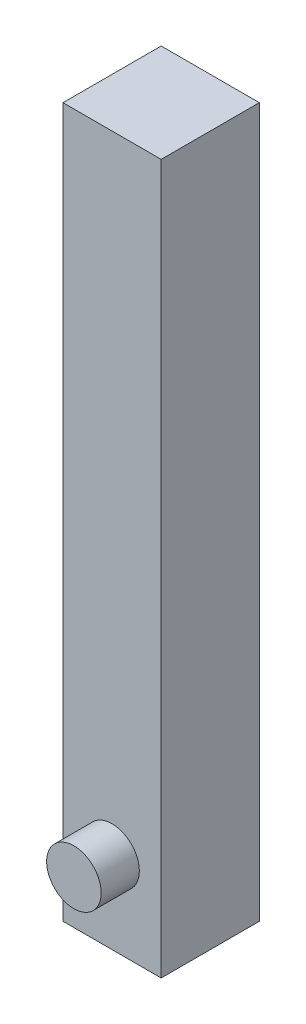
ISO-10303-21;
HEADER;
FILE_DESCRIPTION(('STEP AP214'),'2;1');
FILE_NAME('part.step','',(''),(''),'','','');
FILE_SCHEMA(('AUTOMOTIVE_DESIGN { 1 0 10303 214 1 1 1 1 }'));
ENDSEC;
DATA;
#1=APPLICATION_CONTEXT('core data for automotive mechanical design processes');
#2=APPLICATION_PROTOCOL_DEFINITION('international standard','automotive_design',2000,#1);
#3=PRODUCT_CONTEXT('',#1,'mechanical');
#4=PRODUCT('Part','Part','',(#3));
#5=PRODUCT_RELATED_PRODUCT_CATEGORY('part','',(#4));
#6=PRODUCT_DEFINITION_FORMATION('','',#4);
#7=PRODUCT_DEFINITION_CONTEXT('part definition',#1,'design');
#8=PRODUCT_DEFINITION('design','',#6,#7);
#9=PRODUCT_DEFINITION_SHAPE('','',#8);
#10=(LENGTH_UNIT() NAMED_UNIT(*) SI_UNIT(.MILLI.,.METRE.));
#11=(NAMED_UNIT(*) PLANE_ANGLE_UNIT() SI_UNIT($,.RADIAN.));
#12=(NAMED_UNIT(*) SI_UNIT($,.STERADIAN.) SOLID_ANGLE_UNIT());
#13=UNCERTAINTY_MEASURE_WITH_UNIT(LENGTH_MEASURE(1.E-05),#10,'distance_accuracy_value','');
#14=(GEOMETRIC_REPRESENTATION_CONTEXT(3) GLOBAL_UNCERTAINTY_ASSIGNED_CONTEXT((#13)) GLOBAL_UNIT_ASSIGNED_CONTEXT((#10,
#11,#12)) REPRESENTATION_CONTEXT('',''));
#15=CARTESIAN_POINT('',(0.,0.,0.));
#16=DIRECTION('',(0.,0.,1.));
#17=DIRECTION('',(1.,0.,0.));
#18=AXIS2_PLACEMENT_3D('',#15,#16,#17);
#19=CARTESIAN_POINT('',(4.5,32.5,6.25));
#20=DIRECTION('',(0.,-1.,0.));
#21=DIRECTION('',(0.,0.,-1.));
#22=AXIS2_PLACEMENT_3D('',#19,#20,#21);
#23=PLANE('',#22);
#24=DIRECTION('',(-1.,0.,0.));
#25=VECTOR('',#24,1.);
#26=CARTESIAN_POINT('',(0.,32.5,2.75));
#27=LINE('',#26,#25);
#28=CARTESIAN_POINT('',(4.5,32.5,2.75));
#29=VERTEX_POINT('',#28);
#30=CARTESIAN_POINT('',(-4.5,32.5,2.75));
#31=VERTEX_POINT('',#30);
#32=EDGE_CURVE('E79',#29,#31,#27,.T.);
#33=ORIENTED_EDGE('',*,*,#32,.F.);
#34=DIRECTION('',(0.,0.,-1.));
#35=VECTOR('',#34,1.);
#36=CARTESIAN_POINT('',(4.5,32.5,6.25));
#37=LINE('',#36,#35);
#38=CARTESIAN_POINT('',(4.5,32.5,-6.25));
#39=VERTEX_POINT('',#38);
#40=EDGE_CURVE('E61',#29,#39,#37,.T.);
#41=ORIENTED_EDGE('',*,*,#40,.T.);
#42=DIRECTION('',(-1.,0.,0.));
#43=VECTOR('',#42,1.);
#44=CARTESIAN_POINT('',(4.5,32.5,-6.25));
#45=LINE('',#44,#43);
#46=CARTESIAN_POINT('',(-4.5,32.5,-6.25));
#47=VERTEX_POINT('',#46);
#48=EDGE_CURVE('E109',#39,#47,#45,.T.);
#49=ORIENTED_EDGE('',*,*,#48,.T.);
#50=DIRECTION('',(0.,0.,-1.));
#51=VECTOR('',#50,1.);
#52=CARTESIAN_POINT('',(-4.5,32.5,6.25));
#53=LINE('',#52,#51);
#54=EDGE_CURVE('E11',#31,#47,#53,.T.);
#55=ORIENTED_EDGE('',*,*,#54,.F.);
#56=EDGE_LOOP('',(#33,#41,#49,#55));
#57=FACE_BOUND('',#56,.T.);
#58=ADVANCED_FACE('F39',(#57),#23,.F.);
#59=CARTESIAN_POINT('',(-4.5,-32.5,6.25));
#60=DIRECTION('',(1.,0.,0.));
#61=DIRECTION('',(0.,0.,-1.));
#62=AXIS2_PLACEMENT_3D('',#59,#60,#61);
#63=PLANE('',#62);
#64=DIRECTION('',(0.,-1.,0.));
#65=VECTOR('',#64,1.);
#66=CARTESIAN_POINT('',(-4.5,0.,2.75));
#67=LINE('',#66,#65);
#68=CARTESIAN_POINT('',(-4.5,-32.5,2.75));
#69=VERTEX_POINT('',#68);
#70=EDGE_CURVE('E86',#31,#69,#67,.T.);
#71=ORIENTED_EDGE('',*,*,#70,.F.);
#72=ORIENTED_EDGE('',*,*,#54,.T.);
#73=DIRECTION('',(0.,-1.,0.));
#74=VECTOR('',#73,1.);
#75=CARTESIAN_POINT('',(-4.5,-32.5,-6.25));
#76=LINE('',#75,#74);
#77=CARTESIAN_POINT('',(-4.5,-32.5,-6.25));
#78=VERTEX_POINT('',#77);
#79=EDGE_CURVE('E106',#47,#78,#76,.T.);
#80=ORIENTED_EDGE('',*,*,#79,.T.);
#81=DIRECTION('',(0.,0.,-1.));
#82=VECTOR('',#81,1.);
#83=CARTESIAN_POINT('',(-4.5,-32.5,6.25));
#84=LINE('',#83,#82);
#85=EDGE_CURVE('E46',#69,#78,#84,.T.);
#86=ORIENTED_EDGE('',*,*,#85,.F.);
#87=EDGE_LOOP('',(#71,#72,#80,#86));
#88=FACE_BOUND('',#87,.T.);
#89=ADVANCED_FACE('F107',(#88),#63,.F.);
#90=CARTESIAN_POINT('',(4.5,-32.5,6.25));
#91=DIRECTION('',(0.,1.,0.));
#92=DIRECTION('',(0.,0.,1.));
#93=AXIS2_PLACEMENT_3D('',#90,#91,#92);
#94=PLANE('',#93);
#95=DIRECTION('',(1.,0.,0.));
#96=VECTOR('',#95,1.);
#97=CARTESIAN_POINT('',(0.,-32.5,2.75));
#98=LINE('',#97,#96);
#99=CARTESIAN_POINT('',(4.5,-32.5,2.75));
#100=VERTEX_POINT('',#99);
#101=EDGE_CURVE('E53',#69,#100,#98,.T.);
#102=ORIENTED_EDGE('',*,*,#101,.F.);
#103=ORIENTED_EDGE('',*,*,#85,.T.);
#104=DIRECTION('',(1.,0.,0.));
#105=VECTOR('',#104,1.);
#106=CARTESIAN_POINT('',(4.5,-32.5,-6.25));
#107=LINE('',#106,#105);
#108=CARTESIAN_POINT('',(4.5,-32.5,-6.25));
#109=VERTEX_POINT('',#108);
#110=EDGE_CURVE('E95',#78,#109,#107,.T.);
#111=ORIENTED_EDGE('',*,*,#110,.T.);
#112=DIRECTION('',(0.,0.,-1.));
#113=VECTOR('',#112,1.);
#114=CARTESIAN_POINT('',(4.5,-32.5,6.25));
#115=LINE('',#114,#113);
#116=EDGE_CURVE('E92',#100,#109,#115,.T.);
#117=ORIENTED_EDGE('',*,*,#116,.F.);
#118=EDGE_LOOP('',(#102,#103,#111,#117));
#119=FACE_BOUND('',#118,.T.);
#120=ADVANCED_FACE('F102',(#119),#94,.F.);
#121=CARTESIAN_POINT('',(4.5,-32.5,6.25));
#122=DIRECTION('',(-1.,0.,0.));
#123=DIRECTION('',(0.,0.,1.));
#124=AXIS2_PLACEMENT_3D('',#121,#122,#123);
#125=PLANE('',#124);
#126=DIRECTION('',(0.,1.,0.));
#127=VECTOR('',#126,1.);
#128=CARTESIAN_POINT('',(4.5,0.,2.75));
#129=LINE('',#128,#127);
#130=EDGE_CURVE('E77',#100,#29,#129,.T.);
#131=ORIENTED_EDGE('',*,*,#130,.F.);
#132=ORIENTED_EDGE('',*,*,#116,.T.);
#133=DIRECTION('',(0.,1.,0.));
#134=VECTOR('',#133,1.);
#135=CARTESIAN_POINT('',(4.5,-32.5,-6.25));
#136=LINE('',#135,#134);
#137=EDGE_CURVE('E90',#109,#39,#136,.T.);
#138=ORIENTED_EDGE('',*,*,#137,.T.);
#139=ORIENTED_EDGE('',*,*,#40,.F.);
#140=EDGE_LOOP('',(#131,#132,#138,#139));
#141=FACE_BOUND('',#140,.T.);
#142=ADVANCED_FACE('F88',(#141),#125,.F.);
#143=CARTESIAN_POINT('',(0.,0.,-6.25));
#144=DIRECTION('',(0.,0.,-1.));
#145=DIRECTION('',(-1.,0.,0.));
#146=AXIS2_PLACEMENT_3D('',#143,#144,#145);
#147=PLANE('',#146);
#148=ORIENTED_EDGE('',*,*,#48,.F.);
#149=ORIENTED_EDGE('',*,*,#137,.F.);
#150=ORIENTED_EDGE('',*,*,#110,.F.);
#151=ORIENTED_EDGE('',*,*,#79,.F.);
#152=EDGE_LOOP('',(#148,#149,#150,#151));
#153=FACE_BOUND('',#152,.T.);
#154=ADVANCED_FACE('F111',(#153),#147,.T.);
#155=CARTESIAN_POINT('',(0.,-25.,2.75));
#156=DIRECTION('',(0.,0.,1.));
#157=DIRECTION('',(1.,0.,0.));
#158=AXIS2_PLACEMENT_3D('',#155,#156,#157);
#159=CYLINDRICAL_SURFACE('',#158,2.5);
#160=CARTESIAN_POINT('',(0.,-25.,2.75));
#161=DIRECTION('',(0.,0.,1.));
#162=DIRECTION('',(1.,0.,0.));
#163=AXIS2_PLACEMENT_3D('',#160,#161,#162);
#164=CIRCLE('',#163,2.5);
#165=CARTESIAN_POINT('',(2.5,-25.,2.75));
#166=VERTEX_POINT('',#165);
#167=EDGE_CURVE('E83',#166,#166,#164,.T.);
#168=ORIENTED_EDGE('',*,*,#167,.T.);
#169=EDGE_LOOP('',(#168));
#170=FACE_BOUND('',#169,.T.);
#171=CARTESIAN_POINT('',(0.,-25.,6.25));
#172=DIRECTION('',(0.,0.,1.));
#173=DIRECTION('',(1.,0.,0.));
#174=AXIS2_PLACEMENT_3D('',#171,#172,#173);
#175=CIRCLE('',#174,2.5);
#176=CARTESIAN_POINT('',(2.5,-25.,6.25));
#177=VERTEX_POINT('',#176);
#178=EDGE_CURVE('E114',#177,#177,#175,.T.);
#179=ORIENTED_EDGE('',*,*,#178,.F.);
#180=EDGE_LOOP('',(#179));
#181=FACE_BOUND('',#180,.T.);
#182=ADVANCED_FACE('F122',(#170,#181),#159,.T.);
#183=CARTESIAN_POINT('',(0.,0.,2.75));
#184=DIRECTION('',(0.,0.,1.));
#185=DIRECTION('',(1.,0.,0.));
#186=AXIS2_PLACEMENT_3D('',#183,#184,#185);
#187=PLANE('',#186);
#188=ORIENTED_EDGE('',*,*,#167,.F.);
#189=EDGE_LOOP('',(#188));
#190=FACE_BOUND('',#189,.T.);
#191=ORIENTED_EDGE('',*,*,#130,.T.);
#192=ORIENTED_EDGE('',*,*,#32,.T.);
#193=ORIENTED_EDGE('',*,*,#70,.T.);
#194=ORIENTED_EDGE('',*,*,#101,.T.);
#195=EDGE_LOOP('',(#191,#192,#193,#194));
#196=FACE_BOUND('',#195,.T.);
#197=ADVANCED_FACE('F78',(#190,#196),#187,.T.);
#198=CARTESIAN_POINT('',(0.,0.,6.25));
#199=DIRECTION('',(0.,0.,-1.));
#200=DIRECTION('',(-1.,0.,0.));
#201=AXIS2_PLACEMENT_3D('',#198,#199,#200);
#202=PLANE('',#201);
#203=ORIENTED_EDGE('',*,*,#178,.T.);
#204=EDGE_LOOP('',(#203));
#205=FACE_BOUND('',#204,.T.);
#206=ADVANCED_FACE('F126',(#205),#202,.F.);
#207=CLOSED_SHELL('',(#58,#89,#120,#142,#154,#182,#197,#206));
#208=MANIFOLD_SOLID_BREP('B2',#207);
#209=ADVANCED_BREP_SHAPE_REPRESENTATION('',(#18,#208),#14);
#210=SHAPE_DEFINITION_REPRESENTATION(#9,#209);
ENDSEC;
END-ISO-10303-21;
